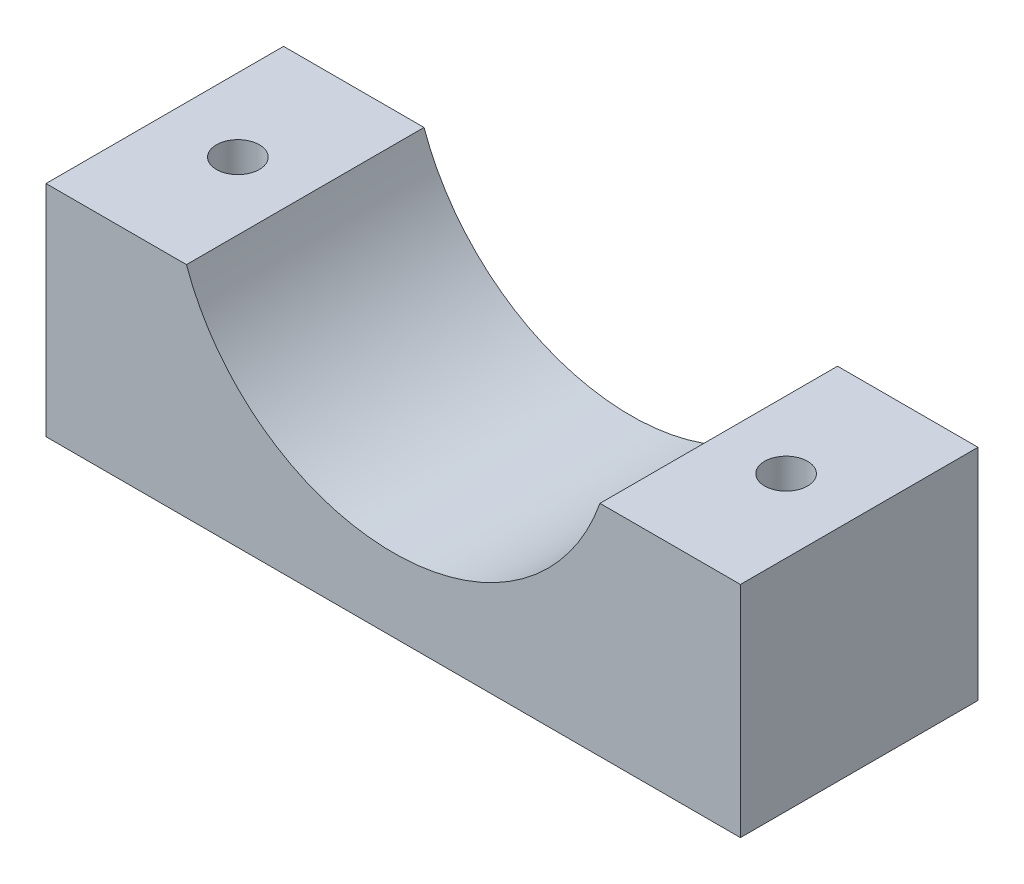
ISO-10303-21;
HEADER;
FILE_DESCRIPTION(('STEP AP214'),'2;1');
FILE_NAME('part.step','',(''),(''),'','','');
FILE_SCHEMA(('AUTOMOTIVE_DESIGN { 1 0 10303 214 1 1 1 1 }'));
ENDSEC;
DATA;
#1=APPLICATION_CONTEXT('core data for automotive mechanical design processes');
#2=APPLICATION_PROTOCOL_DEFINITION('international standard','automotive_design',2000,#1);
#3=PRODUCT_CONTEXT('',#1,'mechanical');
#4=PRODUCT('Part','Part','',(#3));
#5=PRODUCT_RELATED_PRODUCT_CATEGORY('part','',(#4));
#6=PRODUCT_DEFINITION_FORMATION('','',#4);
#7=PRODUCT_DEFINITION_CONTEXT('part definition',#1,'design');
#8=PRODUCT_DEFINITION('design','',#6,#7);
#9=PRODUCT_DEFINITION_SHAPE('','',#8);
#10=(LENGTH_UNIT() NAMED_UNIT(*) SI_UNIT(.MILLI.,.METRE.));
#11=(NAMED_UNIT(*) PLANE_ANGLE_UNIT() SI_UNIT($,.RADIAN.));
#12=(NAMED_UNIT(*) SI_UNIT($,.STERADIAN.) SOLID_ANGLE_UNIT());
#13=UNCERTAINTY_MEASURE_WITH_UNIT(LENGTH_MEASURE(1.E-05),#10,'distance_accuracy_value','');
#14=(GEOMETRIC_REPRESENTATION_CONTEXT(3) GLOBAL_UNCERTAINTY_ASSIGNED_CONTEXT((#13)) GLOBAL_UNIT_ASSIGNED_CONTEXT((#10,
#11,#12)) REPRESENTATION_CONTEXT('',''));
#15=CARTESIAN_POINT('',(0.,0.,0.));
#16=DIRECTION('',(0.,0.,1.));
#17=DIRECTION('',(1.,0.,0.));
#18=AXIS2_PLACEMENT_3D('',#15,#16,#17);
#19=CARTESIAN_POINT('',(0.,12.,0.));
#20=DIRECTION('',(0.,-1.,0.));
#21=DIRECTION('',(0.,0.,-1.));
#22=AXIS2_PLACEMENT_3D('',#19,#20,#21);
#23=PLANE('',#22);
#24=CARTESIAN_POINT('',(34.,12.,-6.5));
#25=DIRECTION('',(0.,-1.,0.));
#26=DIRECTION('',(0.,0.,-1.));
#27=AXIS2_PLACEMENT_3D('',#24,#25,#26);
#28=CIRCLE('',#27,1.17500000000001);
#29=CARTESIAN_POINT('',(34.,12.,-7.67500000000001));
#30=VERTEX_POINT('',#29);
#31=EDGE_CURVE('E203',#30,#30,#28,.T.);
#32=ORIENTED_EDGE('',*,*,#31,.T.);
#33=EDGE_LOOP('',(#32));
#34=FACE_BOUND('',#33,.T.);
#35=DIRECTION('',(-1.,0.,0.));
#36=VECTOR('',#35,1.);
#37=CARTESIAN_POINT('',(0.,12.,-13.));
#38=LINE('',#37,#36);
#39=CARTESIAN_POINT('',(38.,12.,-13.));
#40=VERTEX_POINT('',#39);
#41=CARTESIAN_POINT('',(30.3137084989848,12.,-13.));
#42=VERTEX_POINT('',#41);
#43=EDGE_CURVE('E107',#40,#42,#38,.T.);
#44=ORIENTED_EDGE('',*,*,#43,.T.);
#45=DIRECTION('',(0.,0.,1.));
#46=VECTOR('',#45,1.);
#47=CARTESIAN_POINT('',(30.3137084989848,12.,-46.9411254969543));
#48=LINE('',#47,#46);
#49=CARTESIAN_POINT('',(30.3137084989848,12.,0.));
#50=VERTEX_POINT('',#49);
#51=EDGE_CURVE('E11',#42,#50,#48,.T.);
#52=ORIENTED_EDGE('',*,*,#51,.T.);
#53=DIRECTION('',(1.,0.,0.));
#54=VECTOR('',#53,1.);
#55=CARTESIAN_POINT('',(0.,12.,0.));
#56=LINE('',#55,#54);
#57=CARTESIAN_POINT('',(38.,12.,0.));
#58=VERTEX_POINT('',#57);
#59=EDGE_CURVE('E148',#50,#58,#56,.T.);
#60=ORIENTED_EDGE('',*,*,#59,.T.);
#61=DIRECTION('',(0.,0.,-1.));
#62=VECTOR('',#61,1.);
#63=CARTESIAN_POINT('',(38.,12.,0.));
#64=LINE('',#63,#62);
#65=EDGE_CURVE('E112',#58,#40,#64,.T.);
#66=ORIENTED_EDGE('',*,*,#65,.T.);
#67=EDGE_LOOP('',(#44,#52,#60,#66));
#68=FACE_BOUND('',#67,.T.);
#69=ADVANCED_FACE('F38',(#34,#68),#23,.F.);
#70=CARTESIAN_POINT('',(0.,12.,0.));
#71=DIRECTION('',(1.,0.,0.));
#72=DIRECTION('',(0.,0.,-1.));
#73=AXIS2_PLACEMENT_3D('',#70,#71,#72);
#74=PLANE('',#73);
#75=DIRECTION('',(0.,0.,1.));
#76=VECTOR('',#75,1.);
#77=CARTESIAN_POINT('',(0.,0.,0.));
#78=LINE('',#77,#76);
#79=CARTESIAN_POINT('',(0.,0.,-13.));
#80=VERTEX_POINT('',#79);
#81=CARTESIAN_POINT('',(0.,0.,0.));
#82=VERTEX_POINT('',#81);
#83=EDGE_CURVE('E109',#80,#82,#78,.T.);
#84=ORIENTED_EDGE('',*,*,#83,.T.);
#85=DIRECTION('',(0.,-1.,0.));
#86=VECTOR('',#85,1.);
#87=CARTESIAN_POINT('',(0.,12.,0.));
#88=LINE('',#87,#86);
#89=CARTESIAN_POINT('',(0.,12.,0.));
#90=VERTEX_POINT('',#89);
#91=EDGE_CURVE('E142',#90,#82,#88,.T.);
#92=ORIENTED_EDGE('',*,*,#91,.F.);
#93=DIRECTION('',(0.,0.,1.));
#94=VECTOR('',#93,1.);
#95=CARTESIAN_POINT('',(0.,12.,0.));
#96=LINE('',#95,#94);
#97=CARTESIAN_POINT('',(0.,12.,-13.));
#98=VERTEX_POINT('',#97);
#99=EDGE_CURVE('E134',#98,#90,#96,.T.);
#100=ORIENTED_EDGE('',*,*,#99,.F.);
#101=DIRECTION('',(0.,-1.,0.));
#102=VECTOR('',#101,1.);
#103=CARTESIAN_POINT('',(0.,12.,-13.));
#104=LINE('',#103,#102);
#105=EDGE_CURVE('E115',#98,#80,#104,.T.);
#106=ORIENTED_EDGE('',*,*,#105,.T.);
#107=EDGE_LOOP('',(#84,#92,#100,#106));
#108=FACE_BOUND('',#107,.T.);
#109=ADVANCED_FACE('F40',(#108),#74,.F.);
#110=CARTESIAN_POINT('',(0.,12.,0.));
#111=DIRECTION('',(0.,0.,-1.));
#112=DIRECTION('',(-1.,0.,0.));
#113=AXIS2_PLACEMENT_3D('',#110,#111,#112);
#114=PLANE('',#113);
#115=ORIENTED_EDGE('',*,*,#59,.F.);
#116=CARTESIAN_POINT('',(19.,16.,0.));
#117=DIRECTION('',(0.,0.,1.));
#118=DIRECTION('',(1.,0.,0.));
#119=AXIS2_PLACEMENT_3D('',#116,#117,#118);
#120=CIRCLE('',#119,12.);
#121=CARTESIAN_POINT('',(7.68629150101524,12.,0.));
#122=VERTEX_POINT('',#121);
#123=EDGE_CURVE('E101',#122,#50,#120,.T.);
#124=ORIENTED_EDGE('',*,*,#123,.F.);
#125=EDGE_CURVE('E92',#90,#122,#56,.T.);
#126=ORIENTED_EDGE('',*,*,#125,.F.);
#127=ORIENTED_EDGE('',*,*,#91,.T.);
#128=DIRECTION('',(1.,0.,0.));
#129=VECTOR('',#128,1.);
#130=CARTESIAN_POINT('',(0.,0.,0.));
#131=LINE('',#130,#129);
#132=CARTESIAN_POINT('',(38.,0.,0.));
#133=VERTEX_POINT('',#132);
#134=EDGE_CURVE('E127',#82,#133,#131,.T.);
#135=ORIENTED_EDGE('',*,*,#134,.T.);
#136=DIRECTION('',(0.,-1.,0.));
#137=VECTOR('',#136,1.);
#138=CARTESIAN_POINT('',(38.,12.,0.));
#139=LINE('',#138,#137);
#140=EDGE_CURVE('E138',#58,#133,#139,.T.);
#141=ORIENTED_EDGE('',*,*,#140,.F.);
#142=EDGE_LOOP('',(#115,#124,#126,#127,#135,#141));
#143=FACE_BOUND('',#142,.T.);
#144=ADVANCED_FACE('F146',(#143),#114,.F.);
#145=CARTESIAN_POINT('',(38.,12.,0.));
#146=DIRECTION('',(-1.,0.,0.));
#147=DIRECTION('',(0.,0.,1.));
#148=AXIS2_PLACEMENT_3D('',#145,#146,#147);
#149=PLANE('',#148);
#150=DIRECTION('',(0.,0.,-1.));
#151=VECTOR('',#150,1.);
#152=CARTESIAN_POINT('',(38.,0.,0.));
#153=LINE('',#152,#151);
#154=CARTESIAN_POINT('',(38.,0.,-13.));
#155=VERTEX_POINT('',#154);
#156=EDGE_CURVE('E130',#133,#155,#153,.T.);
#157=ORIENTED_EDGE('',*,*,#156,.T.);
#158=DIRECTION('',(0.,-1.,0.));
#159=VECTOR('',#158,1.);
#160=CARTESIAN_POINT('',(38.,12.,-13.));
#161=LINE('',#160,#159);
#162=EDGE_CURVE('E119',#40,#155,#161,.T.);
#163=ORIENTED_EDGE('',*,*,#162,.F.);
#164=ORIENTED_EDGE('',*,*,#65,.F.);
#165=ORIENTED_EDGE('',*,*,#140,.T.);
#166=EDGE_LOOP('',(#157,#163,#164,#165));
#167=FACE_BOUND('',#166,.T.);
#168=ADVANCED_FACE('F164',(#167),#149,.F.);
#169=CARTESIAN_POINT('',(0.,12.,-13.));
#170=DIRECTION('',(0.,0.,1.));
#171=DIRECTION('',(1.,0.,0.));
#172=AXIS2_PLACEMENT_3D('',#169,#170,#171);
#173=PLANE('',#172);
#174=CARTESIAN_POINT('',(7.68629150101524,12.,-13.));
#175=VERTEX_POINT('',#174);
#176=EDGE_CURVE('E62',#175,#98,#38,.T.);
#177=ORIENTED_EDGE('',*,*,#176,.F.);
#178=CARTESIAN_POINT('',(19.,16.,-13.));
#179=DIRECTION('',(0.,0.,1.));
#180=DIRECTION('',(1.,0.,0.));
#181=AXIS2_PLACEMENT_3D('',#178,#179,#180);
#182=CIRCLE('',#181,12.);
#183=EDGE_CURVE('E54',#42,#175,#182,.F.);
#184=ORIENTED_EDGE('',*,*,#183,.F.);
#185=ORIENTED_EDGE('',*,*,#43,.F.);
#186=ORIENTED_EDGE('',*,*,#162,.T.);
#187=DIRECTION('',(-1.,0.,0.));
#188=VECTOR('',#187,1.);
#189=CARTESIAN_POINT('',(0.,0.,-13.));
#190=LINE('',#189,#188);
#191=EDGE_CURVE('E84',#155,#80,#190,.T.);
#192=ORIENTED_EDGE('',*,*,#191,.T.);
#193=ORIENTED_EDGE('',*,*,#105,.F.);
#194=EDGE_LOOP('',(#177,#184,#185,#186,#192,#193));
#195=FACE_BOUND('',#194,.T.);
#196=ADVANCED_FACE('F106',(#195),#173,.F.);
#197=CARTESIAN_POINT('',(4.,12.,-6.5));
#198=DIRECTION('',(0.,-1.,0.));
#199=DIRECTION('',(0.,0.,-1.));
#200=AXIS2_PLACEMENT_3D('',#197,#198,#199);
#201=CIRCLE('',#200,1.17500000000001);
#202=CARTESIAN_POINT('',(4.,12.,-7.67500000000001));
#203=VERTEX_POINT('',#202);
#204=EDGE_CURVE('E150',#203,#203,#201,.T.);
#205=ORIENTED_EDGE('',*,*,#204,.T.);
#206=EDGE_LOOP('',(#205));
#207=FACE_BOUND('',#206,.T.);
#208=ORIENTED_EDGE('',*,*,#125,.T.);
#209=DIRECTION('',(0.,0.,1.));
#210=VECTOR('',#209,1.);
#211=CARTESIAN_POINT('',(7.68629150101524,12.,-46.9411254969543));
#212=LINE('',#211,#210);
#213=EDGE_CURVE('E47',#122,#175,#212,.F.);
#214=ORIENTED_EDGE('',*,*,#213,.T.);
#215=ORIENTED_EDGE('',*,*,#176,.T.);
#216=ORIENTED_EDGE('',*,*,#99,.T.);
#217=EDGE_LOOP('',(#208,#214,#215,#216));
#218=FACE_BOUND('',#217,.T.);
#219=ADVANCED_FACE('F145',(#207,#218),#23,.F.);
#220=CARTESIAN_POINT('',(0.,0.,0.));
#221=DIRECTION('',(0.,-1.,0.));
#222=DIRECTION('',(0.,0.,-1.));
#223=AXIS2_PLACEMENT_3D('',#220,#221,#222);
#224=PLANE('',#223);
#225=CARTESIAN_POINT('',(34.,0.,-6.5));
#226=DIRECTION('',(0.,-1.,0.));
#227=DIRECTION('',(0.,0.,-1.));
#228=AXIS2_PLACEMENT_3D('',#225,#226,#227);
#229=CIRCLE('',#228,1.17500000000002);
#230=CARTESIAN_POINT('',(34.,0.,-7.67500000000002));
#231=VERTEX_POINT('',#230);
#232=EDGE_CURVE('E205',#231,#231,#229,.T.);
#233=ORIENTED_EDGE('',*,*,#232,.F.);
#234=EDGE_LOOP('',(#233));
#235=FACE_BOUND('',#234,.T.);
#236=CARTESIAN_POINT('',(4.,0.,-6.5));
#237=DIRECTION('',(0.,-1.,0.));
#238=DIRECTION('',(0.,0.,-1.));
#239=AXIS2_PLACEMENT_3D('',#236,#237,#238);
#240=CIRCLE('',#239,1.17500000000001);
#241=CARTESIAN_POINT('',(4.,0.,-7.67500000000001));
#242=VERTEX_POINT('',#241);
#243=EDGE_CURVE('E154',#242,#242,#240,.T.);
#244=ORIENTED_EDGE('',*,*,#243,.F.);
#245=EDGE_LOOP('',(#244));
#246=FACE_BOUND('',#245,.T.);
#247=ORIENTED_EDGE('',*,*,#83,.F.);
#248=ORIENTED_EDGE('',*,*,#191,.F.);
#249=ORIENTED_EDGE('',*,*,#156,.F.);
#250=ORIENTED_EDGE('',*,*,#134,.F.);
#251=EDGE_LOOP('',(#247,#248,#249,#250));
#252=FACE_BOUND('',#251,.T.);
#253=ADVANCED_FACE('F167',(#235,#246,#252),#224,.T.);
#254=CARTESIAN_POINT('',(19.,16.,-46.9411254969543));
#255=DIRECTION('',(0.,0.,1.));
#256=DIRECTION('',(1.,0.,0.));
#257=AXIS2_PLACEMENT_3D('',#254,#255,#256);
#258=CYLINDRICAL_SURFACE('',#257,12.);
#259=ORIENTED_EDGE('',*,*,#183,.T.);
#260=ORIENTED_EDGE('',*,*,#213,.F.);
#261=ORIENTED_EDGE('',*,*,#123,.T.);
#262=ORIENTED_EDGE('',*,*,#51,.F.);
#263=EDGE_LOOP('',(#259,#260,#261,#262));
#264=FACE_BOUND('',#263,.T.);
#265=ADVANCED_FACE('F100',(#264),#258,.F.);
#266=CARTESIAN_POINT('',(4.,0.,-6.5));
#267=DIRECTION('',(0.,-1.,0.));
#268=DIRECTION('',(0.,0.,-1.));
#269=AXIS2_PLACEMENT_3D('',#266,#267,#268);
#270=CYLINDRICAL_SURFACE('',#269,1.17500000000001);
#271=ORIENTED_EDGE('',*,*,#204,.F.);
#272=EDGE_LOOP('',(#271));
#273=FACE_BOUND('',#272,.T.);
#274=ORIENTED_EDGE('',*,*,#243,.T.);
#275=EDGE_LOOP('',(#274));
#276=FACE_BOUND('',#275,.T.);
#277=ADVANCED_FACE('F194',(#273,#276),#270,.F.);
#278=CARTESIAN_POINT('',(34.,0.,-6.5));
#279=DIRECTION('',(0.,-1.,0.));
#280=DIRECTION('',(0.,0.,-1.));
#281=AXIS2_PLACEMENT_3D('',#278,#279,#280);
#282=CYLINDRICAL_SURFACE('',#281,1.17500000000001);
#283=ORIENTED_EDGE('',*,*,#31,.F.);
#284=EDGE_LOOP('',(#283));
#285=FACE_BOUND('',#284,.T.);
#286=ORIENTED_EDGE('',*,*,#232,.T.);
#287=EDGE_LOOP('',(#286));
#288=FACE_BOUND('',#287,.T.);
#289=ADVANCED_FACE('F197',(#285,#288),#282,.F.);
#290=CLOSED_SHELL('',(#69,#109,#144,#168,#196,#219,#253,#265,#277,#289));
#291=MANIFOLD_SOLID_BREP('B2',#290);
#292=ADVANCED_BREP_SHAPE_REPRESENTATION('',(#18,#291),#14);
#293=SHAPE_DEFINITION_REPRESENTATION(#9,#292);
ENDSEC;
END-ISO-10303-21;
